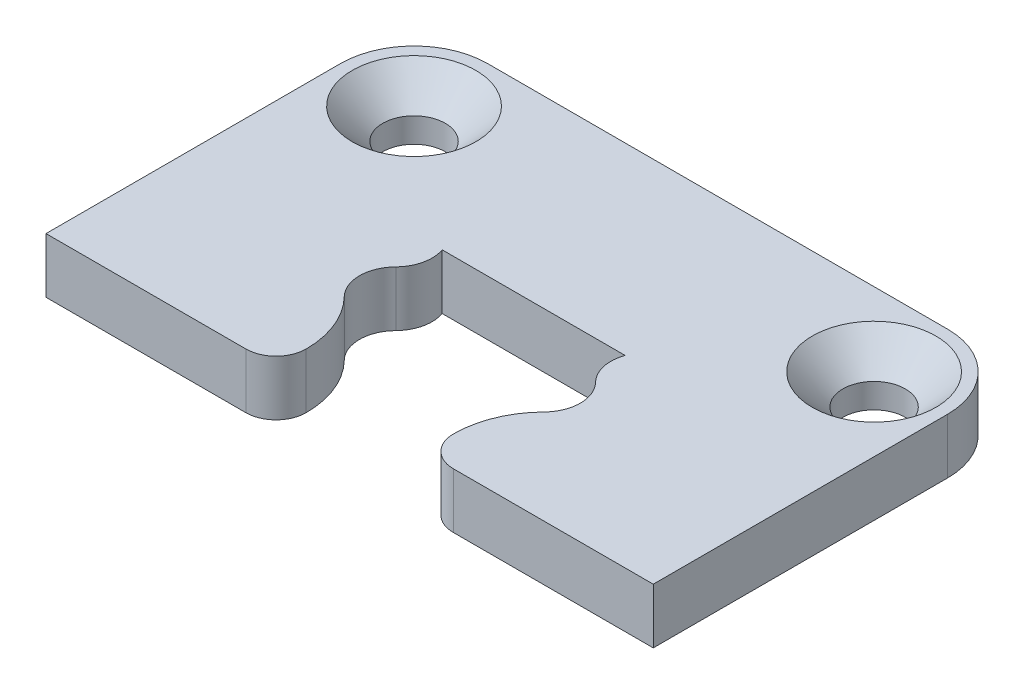
ISO-10303-21;
HEADER;
FILE_DESCRIPTION(('STEP AP214'),'2;1');
FILE_NAME('part.step','',(''),(''),'','','');
FILE_SCHEMA(('AUTOMOTIVE_DESIGN { 1 0 10303 214 1 1 1 1 }'));
ENDSEC;
DATA;
#1=APPLICATION_CONTEXT('core data for automotive mechanical design processes');
#2=APPLICATION_PROTOCOL_DEFINITION('international standard','automotive_design',2000,#1);
#3=PRODUCT_CONTEXT('',#1,'mechanical');
#4=PRODUCT('Part','Part','',(#3));
#5=PRODUCT_RELATED_PRODUCT_CATEGORY('part','',(#4));
#6=PRODUCT_DEFINITION_FORMATION('','',#4);
#7=PRODUCT_DEFINITION_CONTEXT('part definition',#1,'design');
#8=PRODUCT_DEFINITION('design','',#6,#7);
#9=PRODUCT_DEFINITION_SHAPE('','',#8);
#10=(LENGTH_UNIT() NAMED_UNIT(*) SI_UNIT(.MILLI.,.METRE.));
#11=(NAMED_UNIT(*) PLANE_ANGLE_UNIT() SI_UNIT($,.RADIAN.));
#12=(NAMED_UNIT(*) SI_UNIT($,.STERADIAN.) SOLID_ANGLE_UNIT());
#13=UNCERTAINTY_MEASURE_WITH_UNIT(LENGTH_MEASURE(1.E-05),#10,'distance_accuracy_value','');
#14=(GEOMETRIC_REPRESENTATION_CONTEXT(3) GLOBAL_UNCERTAINTY_ASSIGNED_CONTEXT((#13)) GLOBAL_UNIT_ASSIGNED_CONTEXT((#10,
#11,#12)) REPRESENTATION_CONTEXT('',''));
#15=CARTESIAN_POINT('',(0.,0.,0.));
#16=DIRECTION('',(0.,0.,1.));
#17=DIRECTION('',(1.,0.,0.));
#18=AXIS2_PLACEMENT_3D('',#15,#16,#17);
#19=CARTESIAN_POINT('',(-16.5,3.,-20.));
#20=DIRECTION('',(1.,0.,0.));
#21=DIRECTION('',(0.,0.,-1.));
#22=AXIS2_PLACEMENT_3D('',#19,#20,#21);
#23=PLANE('',#22);
#24=DIRECTION('',(0.,0.,1.));
#25=VECTOR('',#24,1.);
#26=CARTESIAN_POINT('',(-16.5,3.,-20.));
#27=LINE('',#26,#25);
#28=CARTESIAN_POINT('',(-16.5,3.,-16.));
#29=VERTEX_POINT('',#28);
#30=CARTESIAN_POINT('',(-16.5,3.,0.));
#31=VERTEX_POINT('',#30);
#32=EDGE_CURVE('E155',#29,#31,#27,.T.);
#33=ORIENTED_EDGE('',*,*,#32,.F.);
#34=DIRECTION('',(0.,-1.,0.));
#35=VECTOR('',#34,1.);
#36=CARTESIAN_POINT('',(-16.5,3.,-16.));
#37=LINE('',#36,#35);
#38=CARTESIAN_POINT('',(-16.5,0.,-16.));
#39=VERTEX_POINT('',#38);
#40=EDGE_CURVE('E11',#29,#39,#37,.T.);
#41=ORIENTED_EDGE('',*,*,#40,.T.);
#42=DIRECTION('',(0.,0.,1.));
#43=VECTOR('',#42,1.);
#44=CARTESIAN_POINT('',(-16.5,0.,-20.));
#45=LINE('',#44,#43);
#46=CARTESIAN_POINT('',(-16.5,0.,0.));
#47=VERTEX_POINT('',#46);
#48=EDGE_CURVE('E177',#39,#47,#45,.T.);
#49=ORIENTED_EDGE('',*,*,#48,.T.);
#50=DIRECTION('',(0.,-1.,0.));
#51=VECTOR('',#50,1.);
#52=CARTESIAN_POINT('',(-16.5,3.,0.));
#53=LINE('',#52,#51);
#54=EDGE_CURVE('E169',#31,#47,#53,.T.);
#55=ORIENTED_EDGE('',*,*,#54,.F.);
#56=EDGE_LOOP('',(#33,#41,#49,#55));
#57=FACE_BOUND('',#56,.T.);
#58=ADVANCED_FACE('F41',(#57),#23,.F.);
#59=CARTESIAN_POINT('',(-16.5,3.,0.));
#60=DIRECTION('',(0.,0.,-1.));
#61=DIRECTION('',(-1.,0.,0.));
#62=AXIS2_PLACEMENT_3D('',#59,#60,#61);
#63=PLANE('',#62);
#64=DIRECTION('',(1.,0.,0.));
#65=VECTOR('',#64,1.);
#66=CARTESIAN_POINT('',(-16.5,0.,0.));
#67=LINE('',#66,#65);
#68=CARTESIAN_POINT('',(-5.6369188992959,0.,0.));
#69=VERTEX_POINT('',#68);
#70=EDGE_CURVE('E302',#47,#69,#67,.T.);
#71=ORIENTED_EDGE('',*,*,#70,.T.);
#72=DIRECTION('',(0.,-1.,0.));
#73=VECTOR('',#72,1.);
#74=CARTESIAN_POINT('',(-5.6369188992959,3.,0.));
#75=LINE('',#74,#73);
#76=CARTESIAN_POINT('',(-5.6369188992959,3.,0.));
#77=VERTEX_POINT('',#76);
#78=EDGE_CURVE('E171',#77,#69,#75,.T.);
#79=ORIENTED_EDGE('',*,*,#78,.F.);
#80=DIRECTION('',(1.,0.,0.));
#81=VECTOR('',#80,1.);
#82=CARTESIAN_POINT('',(-16.5,3.,0.));
#83=LINE('',#82,#81);
#84=EDGE_CURVE('E158',#31,#77,#83,.T.);
#85=ORIENTED_EDGE('',*,*,#84,.F.);
#86=ORIENTED_EDGE('',*,*,#54,.T.);
#87=EDGE_LOOP('',(#71,#79,#85,#86));
#88=FACE_BOUND('',#87,.T.);
#89=ADVANCED_FACE('F168',(#88),#63,.F.);
#90=CARTESIAN_POINT('',(-5.6369188992959,3.,-1.63691889929589));
#91=DIRECTION('',(0.,-1.,0.));
#92=DIRECTION('',(0.,0.,-1.));
#93=AXIS2_PLACEMENT_3D('',#90,#91,#92);
#94=CYLINDRICAL_SURFACE('',#93,1.63691889929589);
#95=CARTESIAN_POINT('',(-5.6369188992959,0.,-1.63691889929589));
#96=DIRECTION('',(0.,1.,0.));
#97=DIRECTION('',(0.,0.,1.));
#98=AXIS2_PLACEMENT_3D('',#95,#96,#97);
#99=CIRCLE('',#98,1.63691889929589);
#100=CARTESIAN_POINT('',(-4.,0.,-1.6369188992959));
#101=VERTEX_POINT('',#100);
#102=EDGE_CURVE('E293',#69,#101,#99,.T.);
#103=ORIENTED_EDGE('',*,*,#102,.T.);
#104=DIRECTION('',(0.,-1.,0.));
#105=VECTOR('',#104,1.);
#106=CARTESIAN_POINT('',(-4.,3.,-1.6369188992959));
#107=LINE('',#106,#105);
#108=CARTESIAN_POINT('',(-4.,3.,-1.6369188992959));
#109=VERTEX_POINT('',#108);
#110=EDGE_CURVE('E186',#109,#101,#107,.T.);
#111=ORIENTED_EDGE('',*,*,#110,.F.);
#112=CARTESIAN_POINT('',(-5.6369188992959,3.,-1.63691889929589));
#113=DIRECTION('',(0.,1.,0.));
#114=DIRECTION('',(0.,0.,1.));
#115=AXIS2_PLACEMENT_3D('',#112,#113,#114);
#116=CIRCLE('',#115,1.63691889929589);
#117=EDGE_CURVE('E174',#77,#109,#116,.T.);
#118=ORIENTED_EDGE('',*,*,#117,.F.);
#119=ORIENTED_EDGE('',*,*,#78,.T.);
#120=EDGE_LOOP('',(#103,#111,#118,#119));
#121=FACE_BOUND('',#120,.T.);
#122=ADVANCED_FACE('F343',(#121),#94,.T.);
#123=CARTESIAN_POINT('',(-9.,3.,-1.63691889929589));
#124=DIRECTION('',(0.,-1.,0.));
#125=DIRECTION('',(0.,0.,-1.));
#126=AXIS2_PLACEMENT_3D('',#123,#124,#125);
#127=CYLINDRICAL_SURFACE('',#126,5.);
#128=CARTESIAN_POINT('',(-9.,0.,-1.63691889929589));
#129=DIRECTION('',(0.,1.,0.));
#130=DIRECTION('',(0.,0.,1.));
#131=AXIS2_PLACEMENT_3D('',#128,#129,#130);
#132=CIRCLE('',#131,5.);
#133=CARTESIAN_POINT('',(-5.42857142857143,0.,-5.13618996041471));
#134=VERTEX_POINT('',#133);
#135=EDGE_CURVE('E288',#101,#134,#132,.T.);
#136=ORIENTED_EDGE('',*,*,#135,.T.);
#137=DIRECTION('',(0.,-1.,0.));
#138=VECTOR('',#137,1.);
#139=CARTESIAN_POINT('',(-5.42857142857143,3.,-5.13618996041471));
#140=LINE('',#139,#138);
#141=CARTESIAN_POINT('',(-5.42857142857143,3.,-5.13618996041471));
#142=VERTEX_POINT('',#141);
#143=EDGE_CURVE('E277',#142,#134,#140,.T.);
#144=ORIENTED_EDGE('',*,*,#143,.F.);
#145=CARTESIAN_POINT('',(-9.,3.,-1.63691889929589));
#146=DIRECTION('',(0.,1.,0.));
#147=DIRECTION('',(0.,0.,1.));
#148=AXIS2_PLACEMENT_3D('',#145,#146,#147);
#149=CIRCLE('',#148,5.);
#150=EDGE_CURVE('E289',#109,#142,#149,.T.);
#151=ORIENTED_EDGE('',*,*,#150,.F.);
#152=ORIENTED_EDGE('',*,*,#110,.T.);
#153=EDGE_LOOP('',(#136,#144,#151,#152));
#154=FACE_BOUND('',#153,.T.);
#155=ADVANCED_FACE('F286',(#154),#127,.T.);
#156=CARTESIAN_POINT('',(-4.,3.,-6.53589838486225));
#157=DIRECTION('',(0.,-1.,0.));
#158=DIRECTION('',(0.,0.,-1.));
#159=AXIS2_PLACEMENT_3D('',#156,#157,#158);
#160=CYLINDRICAL_SURFACE('',#159,2.);
#161=CARTESIAN_POINT('',(-4.,0.,-6.53589838486225));
#162=DIRECTION('',(0.,-1.,0.));
#163=DIRECTION('',(0.,0.,-1.));
#164=AXIS2_PLACEMENT_3D('',#161,#162,#163);
#165=CIRCLE('',#164,2.);
#166=CARTESIAN_POINT('',(-5.42857142857143,0.,-7.93560680930978));
#167=VERTEX_POINT('',#166);
#168=EDGE_CURVE('E295',#134,#167,#165,.T.);
#169=ORIENTED_EDGE('',*,*,#168,.T.);
#170=DIRECTION('',(0.,-1.,0.));
#171=VECTOR('',#170,1.);
#172=CARTESIAN_POINT('',(-5.42857142857143,3.,-7.93560680930978));
#173=LINE('',#172,#171);
#174=CARTESIAN_POINT('',(-5.42857142857143,3.,-7.93560680930978));
#175=VERTEX_POINT('',#174);
#176=EDGE_CURVE('E273',#175,#167,#173,.T.);
#177=ORIENTED_EDGE('',*,*,#176,.F.);
#178=CARTESIAN_POINT('',(-4.,3.,-6.53589838486225));
#179=DIRECTION('',(0.,-1.,0.));
#180=DIRECTION('',(0.,0.,-1.));
#181=AXIS2_PLACEMENT_3D('',#178,#179,#180);
#182=CIRCLE('',#181,2.);
#183=EDGE_CURVE('E347',#142,#175,#182,.T.);
#184=ORIENTED_EDGE('',*,*,#183,.F.);
#185=ORIENTED_EDGE('',*,*,#143,.T.);
#186=EDGE_LOOP('',(#169,#177,#184,#185));
#187=FACE_BOUND('',#186,.T.);
#188=ADVANCED_FACE('F389',(#187),#160,.F.);
#189=CARTESIAN_POINT('',(-6.85714285714285,3.,-9.33531523375731));
#190=DIRECTION('',(0.,-1.,0.));
#191=DIRECTION('',(0.,0.,-1.));
#192=AXIS2_PLACEMENT_3D('',#189,#190,#191);
#193=CYLINDRICAL_SURFACE('',#192,2.);
#194=CARTESIAN_POINT('',(-6.85714285714285,0.,-9.33531523375731));
#195=DIRECTION('',(0.,1.,0.));
#196=DIRECTION('',(0.,0.,1.));
#197=AXIS2_PLACEMENT_3D('',#194,#195,#196);
#198=CIRCLE('',#197,2.);
#199=CARTESIAN_POINT('',(-4.97082523767234,0.,-10.));
#200=VERTEX_POINT('',#199);
#201=EDGE_CURVE('E300',#167,#200,#198,.T.);
#202=ORIENTED_EDGE('',*,*,#201,.T.);
#203=DIRECTION('',(0.,-1.,0.));
#204=VECTOR('',#203,1.);
#205=CARTESIAN_POINT('',(-4.97082523767234,3.,-10.));
#206=LINE('',#205,#204);
#207=CARTESIAN_POINT('',(-4.97082523767234,3.,-10.));
#208=VERTEX_POINT('',#207);
#209=EDGE_CURVE('E269',#208,#200,#206,.T.);
#210=ORIENTED_EDGE('',*,*,#209,.F.);
#211=CARTESIAN_POINT('',(-6.85714285714285,3.,-9.33531523375731));
#212=DIRECTION('',(0.,1.,0.));
#213=DIRECTION('',(0.,0.,1.));
#214=AXIS2_PLACEMENT_3D('',#211,#212,#213);
#215=CIRCLE('',#214,2.);
#216=EDGE_CURVE('E352',#175,#208,#215,.T.);
#217=ORIENTED_EDGE('',*,*,#216,.F.);
#218=ORIENTED_EDGE('',*,*,#176,.T.);
#219=EDGE_LOOP('',(#202,#210,#217,#218));
#220=FACE_BOUND('',#219,.T.);
#221=ADVANCED_FACE('F384',(#220),#193,.T.);
#222=CARTESIAN_POINT('',(-4.97082523767234,3.,-10.));
#223=DIRECTION('',(0.,0.,-1.));
#224=DIRECTION('',(-1.,0.,0.));
#225=AXIS2_PLACEMENT_3D('',#222,#223,#224);
#226=PLANE('',#225);
#227=DIRECTION('',(1.,0.,0.));
#228=VECTOR('',#227,1.);
#229=CARTESIAN_POINT('',(-4.97082523767234,0.,-10.));
#230=LINE('',#229,#228);
#231=CARTESIAN_POINT('',(4.97082523767234,0.,-10.));
#232=VERTEX_POINT('',#231);
#233=EDGE_CURVE('E308',#200,#232,#230,.T.);
#234=ORIENTED_EDGE('',*,*,#233,.T.);
#235=DIRECTION('',(0.,-1.,0.));
#236=VECTOR('',#235,1.);
#237=CARTESIAN_POINT('',(4.97082523767234,3.,-10.));
#238=LINE('',#237,#236);
#239=CARTESIAN_POINT('',(4.97082523767234,3.,-10.));
#240=VERTEX_POINT('',#239);
#241=EDGE_CURVE('E265',#240,#232,#238,.T.);
#242=ORIENTED_EDGE('',*,*,#241,.F.);
#243=DIRECTION('',(1.,0.,0.));
#244=VECTOR('',#243,1.);
#245=CARTESIAN_POINT('',(-4.97082523767234,3.,-10.));
#246=LINE('',#245,#244);
#247=EDGE_CURVE('E355',#208,#240,#246,.T.);
#248=ORIENTED_EDGE('',*,*,#247,.F.);
#249=ORIENTED_EDGE('',*,*,#209,.T.);
#250=EDGE_LOOP('',(#234,#242,#248,#249));
#251=FACE_BOUND('',#250,.T.);
#252=ADVANCED_FACE('F381',(#251),#226,.F.);
#253=CARTESIAN_POINT('',(6.85714285714285,3.,-9.33531523375731));
#254=DIRECTION('',(0.,-1.,0.));
#255=DIRECTION('',(0.,0.,-1.));
#256=AXIS2_PLACEMENT_3D('',#253,#254,#255);
#257=CYLINDRICAL_SURFACE('',#256,2.);
#258=CARTESIAN_POINT('',(6.85714285714285,0.,-9.33531523375731));
#259=DIRECTION('',(0.,1.,0.));
#260=DIRECTION('',(0.,0.,-1.));
#261=AXIS2_PLACEMENT_3D('',#258,#259,#260);
#262=CIRCLE('',#261,2.);
#263=CARTESIAN_POINT('',(5.42857142857143,0.,-7.93560680930978));
#264=VERTEX_POINT('',#263);
#265=EDGE_CURVE('E311',#232,#264,#262,.T.);
#266=ORIENTED_EDGE('',*,*,#265,.T.);
#267=DIRECTION('',(0.,-1.,0.));
#268=VECTOR('',#267,1.);
#269=CARTESIAN_POINT('',(5.42857142857143,3.,-7.93560680930978));
#270=LINE('',#269,#268);
#271=CARTESIAN_POINT('',(5.42857142857143,3.,-7.93560680930978));
#272=VERTEX_POINT('',#271);
#273=EDGE_CURVE('E261',#272,#264,#270,.T.);
#274=ORIENTED_EDGE('',*,*,#273,.F.);
#275=CARTESIAN_POINT('',(6.85714285714285,3.,-9.33531523375731));
#276=DIRECTION('',(0.,1.,0.));
#277=DIRECTION('',(0.,0.,-1.));
#278=AXIS2_PLACEMENT_3D('',#275,#276,#277);
#279=CIRCLE('',#278,2.);
#280=EDGE_CURVE('E358',#240,#272,#279,.T.);
#281=ORIENTED_EDGE('',*,*,#280,.F.);
#282=ORIENTED_EDGE('',*,*,#241,.T.);
#283=EDGE_LOOP('',(#266,#274,#281,#282));
#284=FACE_BOUND('',#283,.T.);
#285=ADVANCED_FACE('F377',(#284),#257,.T.);
#286=CARTESIAN_POINT('',(4.,3.,-6.53589838486225));
#287=DIRECTION('',(0.,-1.,0.));
#288=DIRECTION('',(0.,0.,-1.));
#289=AXIS2_PLACEMENT_3D('',#286,#287,#288);
#290=CYLINDRICAL_SURFACE('',#289,2.);
#291=CARTESIAN_POINT('',(4.,0.,-6.53589838486225));
#292=DIRECTION('',(0.,-1.,0.));
#293=DIRECTION('',(0.,0.,1.));
#294=AXIS2_PLACEMENT_3D('',#291,#292,#293);
#295=CIRCLE('',#294,2.);
#296=CARTESIAN_POINT('',(5.42857142857143,0.,-5.13618996041471));
#297=VERTEX_POINT('',#296);
#298=EDGE_CURVE('E314',#264,#297,#295,.T.);
#299=ORIENTED_EDGE('',*,*,#298,.T.);
#300=DIRECTION('',(0.,-1.,0.));
#301=VECTOR('',#300,1.);
#302=CARTESIAN_POINT('',(5.42857142857143,3.,-5.13618996041471));
#303=LINE('',#302,#301);
#304=CARTESIAN_POINT('',(5.42857142857143,3.,-5.13618996041471));
#305=VERTEX_POINT('',#304);
#306=EDGE_CURVE('E257',#305,#297,#303,.T.);
#307=ORIENTED_EDGE('',*,*,#306,.F.);
#308=CARTESIAN_POINT('',(4.,3.,-6.53589838486225));
#309=DIRECTION('',(0.,-1.,0.));
#310=DIRECTION('',(0.,0.,1.));
#311=AXIS2_PLACEMENT_3D('',#308,#309,#310);
#312=CIRCLE('',#311,2.);
#313=EDGE_CURVE('E361',#272,#305,#312,.T.);
#314=ORIENTED_EDGE('',*,*,#313,.F.);
#315=ORIENTED_EDGE('',*,*,#273,.T.);
#316=EDGE_LOOP('',(#299,#307,#314,#315));
#317=FACE_BOUND('',#316,.T.);
#318=ADVANCED_FACE('F373',(#317),#290,.F.);
#319=CARTESIAN_POINT('',(9.,3.,-1.63691889929589));
#320=DIRECTION('',(0.,-1.,0.));
#321=DIRECTION('',(0.,0.,-1.));
#322=AXIS2_PLACEMENT_3D('',#319,#320,#321);
#323=CYLINDRICAL_SURFACE('',#322,5.);
#324=CARTESIAN_POINT('',(9.,0.,-1.63691889929589));
#325=DIRECTION('',(0.,1.,0.));
#326=DIRECTION('',(0.,0.,-1.));
#327=AXIS2_PLACEMENT_3D('',#324,#325,#326);
#328=CIRCLE('',#327,5.);
#329=CARTESIAN_POINT('',(4.,0.,-1.6369188992959));
#330=VERTEX_POINT('',#329);
#331=EDGE_CURVE('E317',#297,#330,#328,.T.);
#332=ORIENTED_EDGE('',*,*,#331,.T.);
#333=DIRECTION('',(0.,-1.,0.));
#334=VECTOR('',#333,1.);
#335=CARTESIAN_POINT('',(4.,3.,-1.6369188992959));
#336=LINE('',#335,#334);
#337=CARTESIAN_POINT('',(4.,3.,-1.6369188992959));
#338=VERTEX_POINT('',#337);
#339=EDGE_CURVE('E253',#338,#330,#336,.T.);
#340=ORIENTED_EDGE('',*,*,#339,.F.);
#341=CARTESIAN_POINT('',(9.,3.,-1.63691889929589));
#342=DIRECTION('',(0.,1.,0.));
#343=DIRECTION('',(0.,0.,-1.));
#344=AXIS2_PLACEMENT_3D('',#341,#342,#343);
#345=CIRCLE('',#344,5.);
#346=EDGE_CURVE('E337',#305,#338,#345,.T.);
#347=ORIENTED_EDGE('',*,*,#346,.F.);
#348=ORIENTED_EDGE('',*,*,#306,.T.);
#349=EDGE_LOOP('',(#332,#340,#347,#348));
#350=FACE_BOUND('',#349,.T.);
#351=ADVANCED_FACE('F368',(#350),#323,.T.);
#352=CARTESIAN_POINT('',(5.6369188992959,3.,-1.63691889929589));
#353=DIRECTION('',(0.,-1.,0.));
#354=DIRECTION('',(0.,0.,-1.));
#355=AXIS2_PLACEMENT_3D('',#352,#353,#354);
#356=CYLINDRICAL_SURFACE('',#355,1.63691889929589);
#357=CARTESIAN_POINT('',(5.6369188992959,0.,-1.63691889929589));
#358=DIRECTION('',(0.,1.,0.));
#359=DIRECTION('',(0.,0.,-1.));
#360=AXIS2_PLACEMENT_3D('',#357,#358,#359);
#361=CIRCLE('',#360,1.63691889929589);
#362=CARTESIAN_POINT('',(5.6369188992959,0.,0.));
#363=VERTEX_POINT('',#362);
#364=EDGE_CURVE('E243',#330,#363,#361,.T.);
#365=ORIENTED_EDGE('',*,*,#364,.T.);
#366=DIRECTION('',(0.,-1.,0.));
#367=VECTOR('',#366,1.);
#368=CARTESIAN_POINT('',(5.6369188992959,3.,0.));
#369=LINE('',#368,#367);
#370=CARTESIAN_POINT('',(5.6369188992959,3.,0.));
#371=VERTEX_POINT('',#370);
#372=EDGE_CURVE('E249',#371,#363,#369,.T.);
#373=ORIENTED_EDGE('',*,*,#372,.F.);
#374=CARTESIAN_POINT('',(5.6369188992959,3.,-1.63691889929589));
#375=DIRECTION('',(0.,1.,0.));
#376=DIRECTION('',(0.,0.,-1.));
#377=AXIS2_PLACEMENT_3D('',#374,#375,#376);
#378=CIRCLE('',#377,1.63691889929589);
#379=EDGE_CURVE('E332',#338,#371,#378,.T.);
#380=ORIENTED_EDGE('',*,*,#379,.F.);
#381=ORIENTED_EDGE('',*,*,#339,.T.);
#382=EDGE_LOOP('',(#365,#373,#380,#381));
#383=FACE_BOUND('',#382,.T.);
#384=ADVANCED_FACE('F323',(#383),#356,.T.);
#385=CARTESIAN_POINT('',(5.6369188992959,3.,0.));
#386=DIRECTION('',(0.,0.,-1.));
#387=DIRECTION('',(-1.,0.,0.));
#388=AXIS2_PLACEMENT_3D('',#385,#386,#387);
#389=PLANE('',#388);
#390=DIRECTION('',(1.,0.,0.));
#391=VECTOR('',#390,1.);
#392=CARTESIAN_POINT('',(5.6369188992959,0.,0.));
#393=LINE('',#392,#391);
#394=CARTESIAN_POINT('',(16.5,0.,0.));
#395=VERTEX_POINT('',#394);
#396=EDGE_CURVE('E238',#363,#395,#393,.T.);
#397=ORIENTED_EDGE('',*,*,#396,.T.);
#398=DIRECTION('',(0.,-1.,0.));
#399=VECTOR('',#398,1.);
#400=CARTESIAN_POINT('',(16.5,3.,0.));
#401=LINE('',#400,#399);
#402=CARTESIAN_POINT('',(16.5,3.,0.));
#403=VERTEX_POINT('',#402);
#404=EDGE_CURVE('E226',#403,#395,#401,.T.);
#405=ORIENTED_EDGE('',*,*,#404,.F.);
#406=DIRECTION('',(1.,0.,0.));
#407=VECTOR('',#406,1.);
#408=CARTESIAN_POINT('',(5.6369188992959,3.,0.));
#409=LINE('',#408,#407);
#410=EDGE_CURVE('E330',#371,#403,#409,.T.);
#411=ORIENTED_EDGE('',*,*,#410,.F.);
#412=ORIENTED_EDGE('',*,*,#372,.T.);
#413=EDGE_LOOP('',(#397,#405,#411,#412));
#414=FACE_BOUND('',#413,.T.);
#415=ADVANCED_FACE('F329',(#414),#389,.F.);
#416=CARTESIAN_POINT('',(16.5,3.,-20.));
#417=DIRECTION('',(-1.,0.,0.));
#418=DIRECTION('',(0.,0.,1.));
#419=AXIS2_PLACEMENT_3D('',#416,#417,#418);
#420=PLANE('',#419);
#421=DIRECTION('',(0.,0.,-1.));
#422=VECTOR('',#421,1.);
#423=CARTESIAN_POINT('',(16.5,0.,-20.));
#424=LINE('',#423,#422);
#425=CARTESIAN_POINT('',(16.5,0.,-16.));
#426=VERTEX_POINT('',#425);
#427=EDGE_CURVE('E233',#395,#426,#424,.T.);
#428=ORIENTED_EDGE('',*,*,#427,.T.);
#429=DIRECTION('',(0.,-1.,0.));
#430=VECTOR('',#429,1.);
#431=CARTESIAN_POINT('',(16.5,3.,-16.));
#432=LINE('',#431,#430);
#433=CARTESIAN_POINT('',(16.5,3.,-16.));
#434=VERTEX_POINT('',#433);
#435=EDGE_CURVE('E65',#426,#434,#432,.F.);
#436=ORIENTED_EDGE('',*,*,#435,.T.);
#437=DIRECTION('',(0.,0.,-1.));
#438=VECTOR('',#437,1.);
#439=CARTESIAN_POINT('',(16.5,3.,-20.));
#440=LINE('',#439,#438);
#441=EDGE_CURVE('E217',#403,#434,#440,.T.);
#442=ORIENTED_EDGE('',*,*,#441,.F.);
#443=ORIENTED_EDGE('',*,*,#404,.T.);
#444=EDGE_LOOP('',(#428,#436,#442,#443));
#445=FACE_BOUND('',#444,.T.);
#446=ADVANCED_FACE('F235',(#445),#420,.F.);
#447=CARTESIAN_POINT('',(-16.5,3.,-20.));
#448=DIRECTION('',(0.,0.,1.));
#449=DIRECTION('',(1.,0.,0.));
#450=AXIS2_PLACEMENT_3D('',#447,#448,#449);
#451=PLANE('',#450);
#452=DIRECTION('',(-1.,0.,0.));
#453=VECTOR('',#452,1.);
#454=CARTESIAN_POINT('',(-16.5,3.,-20.));
#455=LINE('',#454,#453);
#456=CARTESIAN_POINT('',(12.5,3.,-20.));
#457=VERTEX_POINT('',#456);
#458=CARTESIAN_POINT('',(-12.5,3.,-20.));
#459=VERTEX_POINT('',#458);
#460=EDGE_CURVE('E216',#457,#459,#455,.T.);
#461=ORIENTED_EDGE('',*,*,#460,.F.);
#462=DIRECTION('',(0.,-1.,0.));
#463=VECTOR('',#462,1.);
#464=CARTESIAN_POINT('',(12.5,3.,-20.));
#465=LINE('',#464,#463);
#466=CARTESIAN_POINT('',(12.5,0.,-20.));
#467=VERTEX_POINT('',#466);
#468=EDGE_CURVE('E184',#457,#467,#465,.T.);
#469=ORIENTED_EDGE('',*,*,#468,.T.);
#470=DIRECTION('',(-1.,0.,0.));
#471=VECTOR('',#470,1.);
#472=CARTESIAN_POINT('',(-16.5,0.,-20.));
#473=LINE('',#472,#471);
#474=CARTESIAN_POINT('',(-12.5,0.,-20.));
#475=VERTEX_POINT('',#474);
#476=EDGE_CURVE('E164',#467,#475,#473,.T.);
#477=ORIENTED_EDGE('',*,*,#476,.T.);
#478=DIRECTION('',(0.,-1.,0.));
#479=VECTOR('',#478,1.);
#480=CARTESIAN_POINT('',(-12.5,3.,-20.));
#481=LINE('',#480,#479);
#482=EDGE_CURVE('E180',#475,#459,#481,.F.);
#483=ORIENTED_EDGE('',*,*,#482,.T.);
#484=EDGE_LOOP('',(#461,#469,#477,#483));
#485=FACE_BOUND('',#484,.T.);
#486=ADVANCED_FACE('F221',(#485),#451,.F.);
#487=CARTESIAN_POINT('',(-5.6369188992959,3.,-1.63691889929589));
#488=DIRECTION('',(0.,1.,0.));
#489=DIRECTION('',(0.,0.,1.));
#490=AXIS2_PLACEMENT_3D('',#487,#488,#489);
#491=PLANE('',#490);
#492=CARTESIAN_POINT('',(12.5,3.,-16.));
#493=DIRECTION('',(0.,1.,0.));
#494=DIRECTION('',(0.,0.,1.));
#495=AXIS2_PLACEMENT_3D('',#492,#493,#494);
#496=CIRCLE('',#495,3.36);
#497=CARTESIAN_POINT('',(12.5,3.,-12.64));
#498=VERTEX_POINT('',#497);
#499=EDGE_CURVE('E585',#498,#498,#496,.T.);
#500=ORIENTED_EDGE('',*,*,#499,.F.);
#501=EDGE_LOOP('',(#500));
#502=FACE_BOUND('',#501,.T.);
#503=CARTESIAN_POINT('',(-12.5,3.,-16.));
#504=DIRECTION('',(0.,1.,0.));
#505=DIRECTION('',(0.,0.,1.));
#506=AXIS2_PLACEMENT_3D('',#503,#504,#505);
#507=CIRCLE('',#506,3.36);
#508=CARTESIAN_POINT('',(-12.5,3.,-12.64));
#509=VERTEX_POINT('',#508);
#510=EDGE_CURVE('E198',#509,#509,#507,.T.);
#511=ORIENTED_EDGE('',*,*,#510,.F.);
#512=EDGE_LOOP('',(#511));
#513=FACE_BOUND('',#512,.T.);
#514=ORIENTED_EDGE('',*,*,#441,.T.);
#515=CARTESIAN_POINT('',(12.5,3.,-16.));
#516=DIRECTION('',(0.,1.,0.));
#517=DIRECTION('',(0.,0.,1.));
#518=AXIS2_PLACEMENT_3D('',#515,#516,#517);
#519=CIRCLE('',#518,4.);
#520=EDGE_CURVE('E50',#434,#457,#519,.T.);
#521=ORIENTED_EDGE('',*,*,#520,.T.);
#522=ORIENTED_EDGE('',*,*,#460,.T.);
#523=CARTESIAN_POINT('',(-12.5,3.,-16.));
#524=DIRECTION('',(0.,1.,0.));
#525=DIRECTION('',(0.,0.,1.));
#526=AXIS2_PLACEMENT_3D('',#523,#524,#525);
#527=CIRCLE('',#526,4.);
#528=EDGE_CURVE('E57',#459,#29,#527,.T.);
#529=ORIENTED_EDGE('',*,*,#528,.T.);
#530=ORIENTED_EDGE('',*,*,#32,.T.);
#531=ORIENTED_EDGE('',*,*,#84,.T.);
#532=ORIENTED_EDGE('',*,*,#117,.T.);
#533=ORIENTED_EDGE('',*,*,#150,.T.);
#534=ORIENTED_EDGE('',*,*,#183,.T.);
#535=ORIENTED_EDGE('',*,*,#216,.T.);
#536=ORIENTED_EDGE('',*,*,#247,.T.);
#537=ORIENTED_EDGE('',*,*,#280,.T.);
#538=ORIENTED_EDGE('',*,*,#313,.T.);
#539=ORIENTED_EDGE('',*,*,#346,.T.);
#540=ORIENTED_EDGE('',*,*,#379,.T.);
#541=ORIENTED_EDGE('',*,*,#410,.T.);
#542=EDGE_LOOP('',(#514,#521,#522,#529,#530,#531,#532,#533,#534,#535,#536,#537,#538,#539,#540,#541));
#543=FACE_BOUND('',#542,.T.);
#544=ADVANCED_FACE('F157',(#502,#513,#543),#491,.T.);
#545=CARTESIAN_POINT('',(-5.6369188992959,0.,-1.63691889929589));
#546=DIRECTION('',(0.,1.,0.));
#547=DIRECTION('',(0.,0.,1.));
#548=AXIS2_PLACEMENT_3D('',#545,#546,#547);
#549=PLANE('',#548);
#550=CARTESIAN_POINT('',(12.5,0.,-16.));
#551=DIRECTION('',(0.,1.,0.));
#552=DIRECTION('',(0.,0.,1.));
#553=AXIS2_PLACEMENT_3D('',#550,#551,#552);
#554=CIRCLE('',#553,1.7);
#555=CARTESIAN_POINT('',(12.5,0.,-14.3));
#556=VERTEX_POINT('',#555);
#557=EDGE_CURVE('E195',#556,#556,#554,.T.);
#558=ORIENTED_EDGE('',*,*,#557,.T.);
#559=EDGE_LOOP('',(#558));
#560=FACE_BOUND('',#559,.T.);
#561=CARTESIAN_POINT('',(-12.5,0.,-16.));
#562=DIRECTION('',(0.,1.,0.));
#563=DIRECTION('',(0.,0.,1.));
#564=AXIS2_PLACEMENT_3D('',#561,#562,#563);
#565=CIRCLE('',#564,1.7);
#566=CARTESIAN_POINT('',(-12.5,0.,-14.3));
#567=VERTEX_POINT('',#566);
#568=EDGE_CURVE('E190',#567,#567,#565,.T.);
#569=ORIENTED_EDGE('',*,*,#568,.T.);
#570=EDGE_LOOP('',(#569));
#571=FACE_BOUND('',#570,.T.);
#572=ORIENTED_EDGE('',*,*,#476,.F.);
#573=CARTESIAN_POINT('',(12.5,0.,-16.));
#574=DIRECTION('',(0.,1.,0.));
#575=DIRECTION('',(0.,0.,1.));
#576=AXIS2_PLACEMENT_3D('',#573,#574,#575);
#577=CIRCLE('',#576,4.);
#578=EDGE_CURVE('E207',#467,#426,#577,.F.);
#579=ORIENTED_EDGE('',*,*,#578,.T.);
#580=ORIENTED_EDGE('',*,*,#427,.F.);
#581=ORIENTED_EDGE('',*,*,#396,.F.);
#582=ORIENTED_EDGE('',*,*,#364,.F.);
#583=ORIENTED_EDGE('',*,*,#331,.F.);
#584=ORIENTED_EDGE('',*,*,#298,.F.);
#585=ORIENTED_EDGE('',*,*,#265,.F.);
#586=ORIENTED_EDGE('',*,*,#233,.F.);
#587=ORIENTED_EDGE('',*,*,#201,.F.);
#588=ORIENTED_EDGE('',*,*,#168,.F.);
#589=ORIENTED_EDGE('',*,*,#135,.F.);
#590=ORIENTED_EDGE('',*,*,#102,.F.);
#591=ORIENTED_EDGE('',*,*,#70,.F.);
#592=ORIENTED_EDGE('',*,*,#48,.F.);
#593=CARTESIAN_POINT('',(-12.5,0.,-16.));
#594=DIRECTION('',(0.,1.,0.));
#595=DIRECTION('',(0.,0.,1.));
#596=AXIS2_PLACEMENT_3D('',#593,#594,#595);
#597=CIRCLE('',#596,4.);
#598=EDGE_CURVE('E204',#39,#475,#597,.F.);
#599=ORIENTED_EDGE('',*,*,#598,.T.);
#600=EDGE_LOOP('',(#572,#579,#580,#581,#582,#583,#584,#585,#586,#587,#588,#589,#590,#591,#592,#599));
#601=FACE_BOUND('',#600,.T.);
#602=ADVANCED_FACE('F231',(#560,#571,#601),#549,.F.);
#603=CARTESIAN_POINT('',(-12.5,3.,-16.));
#604=DIRECTION('',(0.,1.,0.));
#605=DIRECTION('',(0.,0.,1.));
#606=AXIS2_PLACEMENT_3D('',#603,#604,#605);
#607=CYLINDRICAL_SURFACE('',#606,1.7);
#608=CARTESIAN_POINT('',(-12.5,1.34,-16.));
#609=DIRECTION('',(0.,1.,0.));
#610=DIRECTION('',(0.,0.,1.));
#611=AXIS2_PLACEMENT_3D('',#608,#609,#610);
#612=CIRCLE('',#611,1.7);
#613=CARTESIAN_POINT('',(-12.5,1.34,-14.3));
#614=VERTEX_POINT('',#613);
#615=EDGE_CURVE('E194',#614,#614,#612,.T.);
#616=ORIENTED_EDGE('',*,*,#615,.T.);
#617=EDGE_LOOP('',(#616));
#618=FACE_BOUND('',#617,.T.);
#619=ORIENTED_EDGE('',*,*,#568,.F.);
#620=EDGE_LOOP('',(#619));
#621=FACE_BOUND('',#620,.T.);
#622=ADVANCED_FACE('F426',(#618,#621),#607,.F.);
#623=CARTESIAN_POINT('',(-12.5,3.,-16.));
#624=DIRECTION('',(0.,1.,0.));
#625=DIRECTION('',(0.,0.,1.));
#626=AXIS2_PLACEMENT_3D('',#623,#624,#625);
#627=CONICAL_SURFACE('',#626,3.36,0.785398163397449);
#628=ORIENTED_EDGE('',*,*,#615,.F.);
#629=EDGE_LOOP('',(#628));
#630=FACE_BOUND('',#629,.T.);
#631=ORIENTED_EDGE('',*,*,#510,.T.);
#632=EDGE_LOOP('',(#631));
#633=FACE_BOUND('',#632,.T.);
#634=ADVANCED_FACE('F418',(#630,#633),#627,.F.);
#635=CARTESIAN_POINT('',(12.5,3.,-16.));
#636=DIRECTION('',(0.,1.,0.));
#637=DIRECTION('',(0.,0.,1.));
#638=AXIS2_PLACEMENT_3D('',#635,#636,#637);
#639=CYLINDRICAL_SURFACE('',#638,1.7);
#640=CARTESIAN_POINT('',(12.5,1.34,-16.));
#641=DIRECTION('',(0.,1.,0.));
#642=DIRECTION('',(0.,0.,1.));
#643=AXIS2_PLACEMENT_3D('',#640,#641,#642);
#644=CIRCLE('',#643,1.7);
#645=CARTESIAN_POINT('',(12.5,1.34,-14.3));
#646=VERTEX_POINT('',#645);
#647=EDGE_CURVE('E199',#646,#646,#644,.T.);
#648=ORIENTED_EDGE('',*,*,#647,.T.);
#649=EDGE_LOOP('',(#648));
#650=FACE_BOUND('',#649,.T.);
#651=ORIENTED_EDGE('',*,*,#557,.F.);
#652=EDGE_LOOP('',(#651));
#653=FACE_BOUND('',#652,.T.);
#654=ADVANCED_FACE('F412',(#650,#653),#639,.F.);
#655=CARTESIAN_POINT('',(12.5,3.,-16.));
#656=DIRECTION('',(0.,1.,0.));
#657=DIRECTION('',(0.,0.,1.));
#658=AXIS2_PLACEMENT_3D('',#655,#656,#657);
#659=CONICAL_SURFACE('',#658,3.36,0.785398163397448);
#660=ORIENTED_EDGE('',*,*,#647,.F.);
#661=EDGE_LOOP('',(#660));
#662=FACE_BOUND('',#661,.T.);
#663=ORIENTED_EDGE('',*,*,#499,.T.);
#664=EDGE_LOOP('',(#663));
#665=FACE_BOUND('',#664,.T.);
#666=ADVANCED_FACE('F406',(#662,#665),#659,.F.);
#667=CARTESIAN_POINT('',(12.5,3.,-16.));
#668=DIRECTION('',(0.,-1.,0.));
#669=DIRECTION('',(0.,0.,-1.));
#670=AXIS2_PLACEMENT_3D('',#667,#668,#669);
#671=CYLINDRICAL_SURFACE('',#670,4.);
#672=ORIENTED_EDGE('',*,*,#520,.F.);
#673=ORIENTED_EDGE('',*,*,#435,.F.);
#674=ORIENTED_EDGE('',*,*,#578,.F.);
#675=ORIENTED_EDGE('',*,*,#468,.F.);
#676=EDGE_LOOP('',(#672,#673,#674,#675));
#677=FACE_BOUND('',#676,.T.);
#678=ADVANCED_FACE('F228',(#677),#671,.T.);
#679=CARTESIAN_POINT('',(-12.5,3.,-16.));
#680=DIRECTION('',(0.,-1.,0.));
#681=DIRECTION('',(0.,0.,-1.));
#682=AXIS2_PLACEMENT_3D('',#679,#680,#681);
#683=CYLINDRICAL_SURFACE('',#682,4.);
#684=ORIENTED_EDGE('',*,*,#528,.F.);
#685=ORIENTED_EDGE('',*,*,#482,.F.);
#686=ORIENTED_EDGE('',*,*,#598,.F.);
#687=ORIENTED_EDGE('',*,*,#40,.F.);
#688=EDGE_LOOP('',(#684,#685,#686,#687));
#689=FACE_BOUND('',#688,.T.);
#690=ADVANCED_FACE('F43',(#689),#683,.T.);
#691=CLOSED_SHELL('',(#58,#89,#122,#155,#188,#221,#252,#285,#318,#351,#384,#415,#446,#486,#544,
#602,#622,#634,#654,#666,#678,#690));
#692=MANIFOLD_SOLID_BREP('B2',#691);
#693=ADVANCED_BREP_SHAPE_REPRESENTATION('',(#18,#692),#14);
#694=SHAPE_DEFINITION_REPRESENTATION(#9,#693);
ENDSEC;
END-ISO-10303-21;
